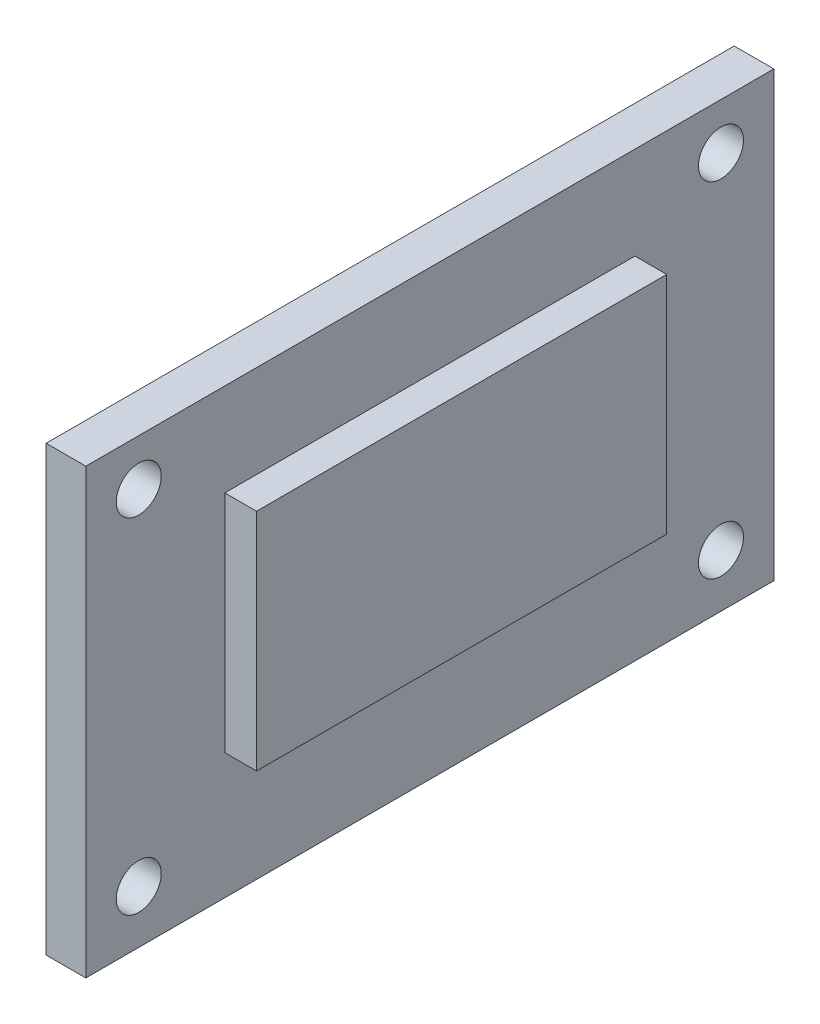
ISO-10303-21;
HEADER;
FILE_DESCRIPTION(('STEP AP214'),'2;1');
FILE_NAME('part.step','',(''),(''),'','','');
FILE_SCHEMA(('AUTOMOTIVE_DESIGN { 1 0 10303 214 1 1 1 1 }'));
ENDSEC;
DATA;
#1=APPLICATION_CONTEXT('core data for automotive mechanical design processes');
#2=APPLICATION_PROTOCOL_DEFINITION('international standard','automotive_design',2000,#1);
#3=PRODUCT_CONTEXT('',#1,'mechanical');
#4=PRODUCT('Part','Part','',(#3));
#5=PRODUCT_RELATED_PRODUCT_CATEGORY('part','',(#4));
#6=PRODUCT_DEFINITION_FORMATION('','',#4);
#7=PRODUCT_DEFINITION_CONTEXT('part definition',#1,'design');
#8=PRODUCT_DEFINITION('design','',#6,#7);
#9=PRODUCT_DEFINITION_SHAPE('','',#8);
#10=(LENGTH_UNIT() NAMED_UNIT(*) SI_UNIT(.MILLI.,.METRE.));
#11=(NAMED_UNIT(*) PLANE_ANGLE_UNIT() SI_UNIT($,.RADIAN.));
#12=(NAMED_UNIT(*) SI_UNIT($,.STERADIAN.) SOLID_ANGLE_UNIT());
#13=UNCERTAINTY_MEASURE_WITH_UNIT(LENGTH_MEASURE(1.E-05),#10,'distance_accuracy_value','');
#14=(GEOMETRIC_REPRESENTATION_CONTEXT(3) GLOBAL_UNCERTAINTY_ASSIGNED_CONTEXT((#13)) GLOBAL_UNIT_ASSIGNED_CONTEXT((#10,
#11,#12)) REPRESENTATION_CONTEXT('',''));
#15=CARTESIAN_POINT('',(0.,0.,0.));
#16=DIRECTION('',(0.,0.,1.));
#17=DIRECTION('',(1.,0.,0.));
#18=AXIS2_PLACEMENT_3D('',#15,#16,#17);
#19=CARTESIAN_POINT('',(-72.4,0.,0.));
#20=DIRECTION('',(1.,0.,0.));
#21=DIRECTION('',(0.,0.,-1.));
#22=AXIS2_PLACEMENT_3D('',#19,#20,#21);
#23=PLANE('',#22);
#24=CARTESIAN_POINT('',(-72.4,3.,86.));
#25=DIRECTION('',(1.,0.,0.));
#26=DIRECTION('',(0.,0.,-1.));
#27=AXIS2_PLACEMENT_3D('',#24,#25,#26);
#28=CIRCLE('',#27,1.69999999999999);
#29=CARTESIAN_POINT('',(-72.4,3.,84.3));
#30=VERTEX_POINT('',#29);
#31=EDGE_CURVE('E136',#30,#30,#28,.F.);
#32=ORIENTED_EDGE('',*,*,#31,.T.);
#33=EDGE_LOOP('',(#32));
#34=FACE_BOUND('',#33,.T.);
#35=CARTESIAN_POINT('',(-72.4,-23.,42.));
#36=DIRECTION('',(1.,0.,0.));
#37=DIRECTION('',(0.,0.,-1.));
#38=AXIS2_PLACEMENT_3D('',#35,#36,#37);
#39=CIRCLE('',#38,1.7);
#40=CARTESIAN_POINT('',(-72.4,-23.,40.3));
#41=VERTEX_POINT('',#40);
#42=EDGE_CURVE('E182',#41,#41,#39,.F.);
#43=ORIENTED_EDGE('',*,*,#42,.T.);
#44=EDGE_LOOP('',(#43));
#45=FACE_BOUND('',#44,.T.);
#46=CARTESIAN_POINT('',(-72.4,3.,42.));
#47=DIRECTION('',(1.,0.,0.));
#48=DIRECTION('',(0.,0.,-1.));
#49=AXIS2_PLACEMENT_3D('',#46,#47,#48);
#50=CIRCLE('',#49,1.7);
#51=CARTESIAN_POINT('',(-72.4,3.,40.3));
#52=VERTEX_POINT('',#51);
#53=EDGE_CURVE('E179',#52,#52,#50,.F.);
#54=ORIENTED_EDGE('',*,*,#53,.T.);
#55=EDGE_LOOP('',(#54));
#56=FACE_BOUND('',#55,.T.);
#57=CARTESIAN_POINT('',(-72.4,-23.,86.));
#58=DIRECTION('',(1.,0.,0.));
#59=DIRECTION('',(0.,0.,-1.));
#60=AXIS2_PLACEMENT_3D('',#57,#58,#59);
#61=CIRCLE('',#60,1.69999999999999);
#62=CARTESIAN_POINT('',(-72.4,-23.,84.3));
#63=VERTEX_POINT('',#62);
#64=EDGE_CURVE('E176',#63,#63,#61,.F.);
#65=ORIENTED_EDGE('',*,*,#64,.T.);
#66=EDGE_LOOP('',(#65));
#67=FACE_BOUND('',#66,.T.);
#68=DIRECTION('',(0.,-1.,0.));
#69=VECTOR('',#68,1.);
#70=CARTESIAN_POINT('',(-72.4,6.5,90.));
#71=LINE('',#70,#69);
#72=CARTESIAN_POINT('',(-72.4,6.5,90.));
#73=VERTEX_POINT('',#72);
#74=CARTESIAN_POINT('',(-72.4,-27.,90.));
#75=VERTEX_POINT('',#74);
#76=EDGE_CURVE('E147',#73,#75,#71,.T.);
#77=ORIENTED_EDGE('',*,*,#76,.T.);
#78=DIRECTION('',(0.,0.,-1.));
#79=VECTOR('',#78,1.);
#80=CARTESIAN_POINT('',(-72.4,-27.,90.));
#81=LINE('',#80,#79);
#82=CARTESIAN_POINT('',(-72.4,-27.,38.));
#83=VERTEX_POINT('',#82);
#84=EDGE_CURVE('E94',#75,#83,#81,.T.);
#85=ORIENTED_EDGE('',*,*,#84,.T.);
#86=DIRECTION('',(0.,1.,0.));
#87=VECTOR('',#86,1.);
#88=CARTESIAN_POINT('',(-72.4,-27.,38.));
#89=LINE('',#88,#87);
#90=CARTESIAN_POINT('',(-72.4,6.5,38.));
#91=VERTEX_POINT('',#90);
#92=EDGE_CURVE('E150',#83,#91,#89,.T.);
#93=ORIENTED_EDGE('',*,*,#92,.T.);
#94=DIRECTION('',(0.,0.,1.));
#95=VECTOR('',#94,1.);
#96=CARTESIAN_POINT('',(-72.4,6.5,38.));
#97=LINE('',#96,#95);
#98=EDGE_CURVE('E65',#91,#73,#97,.T.);
#99=ORIENTED_EDGE('',*,*,#98,.T.);
#100=EDGE_LOOP('',(#77,#85,#93,#99));
#101=FACE_BOUND('',#100,.T.);
#102=DIRECTION('',(0.,0.,1.));
#103=VECTOR('',#102,1.);
#104=CARTESIAN_POINT('',(-72.4,-17.5,0.));
#105=LINE('',#104,#103);
#106=CARTESIAN_POINT('',(-72.4,-17.5,48.5));
#107=VERTEX_POINT('',#106);
#108=CARTESIAN_POINT('',(-72.4,-17.5,79.5));
#109=VERTEX_POINT('',#108);
#110=EDGE_CURVE('E48',#107,#109,#105,.T.);
#111=ORIENTED_EDGE('',*,*,#110,.T.);
#112=DIRECTION('',(0.,1.,0.));
#113=VECTOR('',#112,1.);
#114=CARTESIAN_POINT('',(-72.4,0.,79.5));
#115=LINE('',#114,#113);
#116=CARTESIAN_POINT('',(-72.4,-0.5,79.5));
#117=VERTEX_POINT('',#116);
#118=EDGE_CURVE('E11',#109,#117,#115,.T.);
#119=ORIENTED_EDGE('',*,*,#118,.T.);
#120=DIRECTION('',(0.,0.,-1.));
#121=VECTOR('',#120,1.);
#122=CARTESIAN_POINT('',(-72.4,-0.5,0.));
#123=LINE('',#122,#121);
#124=CARTESIAN_POINT('',(-72.4,-0.5,48.5));
#125=VERTEX_POINT('',#124);
#126=EDGE_CURVE('E166',#117,#125,#123,.T.);
#127=ORIENTED_EDGE('',*,*,#126,.T.);
#128=DIRECTION('',(0.,-1.,0.));
#129=VECTOR('',#128,1.);
#130=CARTESIAN_POINT('',(-72.4,0.,48.5));
#131=LINE('',#130,#129);
#132=EDGE_CURVE('E169',#125,#107,#131,.T.);
#133=ORIENTED_EDGE('',*,*,#132,.T.);
#134=EDGE_LOOP('',(#111,#119,#127,#133));
#135=FACE_BOUND('',#134,.T.);
#136=ADVANCED_FACE('F39',(#34,#45,#56,#67,#101,#135),#23,.T.);
#137=CARTESIAN_POINT('',(-72.4,6.5,90.));
#138=DIRECTION('',(0.,0.,-1.));
#139=DIRECTION('',(-1.,0.,0.));
#140=AXIS2_PLACEMENT_3D('',#137,#138,#139);
#141=PLANE('',#140);
#142=DIRECTION('',(0.,-1.,0.));
#143=VECTOR('',#142,1.);
#144=CARTESIAN_POINT('',(-75.4,6.5,90.));
#145=LINE('',#144,#143);
#146=CARTESIAN_POINT('',(-75.4,6.5,90.));
#147=VERTEX_POINT('',#146);
#148=CARTESIAN_POINT('',(-75.4,-27.,90.));
#149=VERTEX_POINT('',#148);
#150=EDGE_CURVE('E139',#147,#149,#145,.T.);
#151=ORIENTED_EDGE('',*,*,#150,.T.);
#152=DIRECTION('',(-1.,0.,0.));
#153=VECTOR('',#152,1.);
#154=CARTESIAN_POINT('',(-72.4,-27.,90.));
#155=LINE('',#154,#153);
#156=EDGE_CURVE('E164',#75,#149,#155,.T.);
#157=ORIENTED_EDGE('',*,*,#156,.F.);
#158=ORIENTED_EDGE('',*,*,#76,.F.);
#159=DIRECTION('',(-1.,0.,0.));
#160=VECTOR('',#159,1.);
#161=CARTESIAN_POINT('',(-72.4,6.5,90.));
#162=LINE('',#161,#160);
#163=EDGE_CURVE('E152',#73,#147,#162,.T.);
#164=ORIENTED_EDGE('',*,*,#163,.T.);
#165=EDGE_LOOP('',(#151,#157,#158,#164));
#166=FACE_BOUND('',#165,.T.);
#167=ADVANCED_FACE('F41',(#166),#141,.F.);
#168=CARTESIAN_POINT('',(-72.4,-27.,90.));
#169=DIRECTION('',(0.,1.,0.));
#170=DIRECTION('',(0.,0.,1.));
#171=AXIS2_PLACEMENT_3D('',#168,#169,#170);
#172=PLANE('',#171);
#173=DIRECTION('',(0.,0.,-1.));
#174=VECTOR('',#173,1.);
#175=CARTESIAN_POINT('',(-75.4,-27.,90.));
#176=LINE('',#175,#174);
#177=CARTESIAN_POINT('',(-75.4,-27.,38.));
#178=VERTEX_POINT('',#177);
#179=EDGE_CURVE('E142',#149,#178,#176,.T.);
#180=ORIENTED_EDGE('',*,*,#179,.T.);
#181=DIRECTION('',(-1.,0.,0.));
#182=VECTOR('',#181,1.);
#183=CARTESIAN_POINT('',(-72.4,-27.,38.));
#184=LINE('',#183,#182);
#185=EDGE_CURVE('E161',#83,#178,#184,.T.);
#186=ORIENTED_EDGE('',*,*,#185,.F.);
#187=ORIENTED_EDGE('',*,*,#84,.F.);
#188=ORIENTED_EDGE('',*,*,#156,.T.);
#189=EDGE_LOOP('',(#180,#186,#187,#188));
#190=FACE_BOUND('',#189,.T.);
#191=ADVANCED_FACE('F218',(#190),#172,.F.);
#192=CARTESIAN_POINT('',(-72.4,-27.,38.));
#193=DIRECTION('',(0.,0.,1.));
#194=DIRECTION('',(1.,0.,0.));
#195=AXIS2_PLACEMENT_3D('',#192,#193,#194);
#196=PLANE('',#195);
#197=DIRECTION('',(0.,1.,0.));
#198=VECTOR('',#197,1.);
#199=CARTESIAN_POINT('',(-75.4,-27.,38.));
#200=LINE('',#199,#198);
#201=CARTESIAN_POINT('',(-75.4,6.5,38.));
#202=VERTEX_POINT('',#201);
#203=EDGE_CURVE('E155',#178,#202,#200,.T.);
#204=ORIENTED_EDGE('',*,*,#203,.T.);
#205=DIRECTION('',(-1.,0.,0.));
#206=VECTOR('',#205,1.);
#207=CARTESIAN_POINT('',(-72.4,6.5,38.));
#208=LINE('',#207,#206);
#209=EDGE_CURVE('E159',#91,#202,#208,.T.);
#210=ORIENTED_EDGE('',*,*,#209,.F.);
#211=ORIENTED_EDGE('',*,*,#92,.F.);
#212=ORIENTED_EDGE('',*,*,#185,.T.);
#213=EDGE_LOOP('',(#204,#210,#211,#212));
#214=FACE_BOUND('',#213,.T.);
#215=ADVANCED_FACE('F230',(#214),#196,.F.);
#216=CARTESIAN_POINT('',(-72.4,6.5,38.));
#217=DIRECTION('',(0.,-1.,0.));
#218=DIRECTION('',(0.,0.,-1.));
#219=AXIS2_PLACEMENT_3D('',#216,#217,#218);
#220=PLANE('',#219);
#221=DIRECTION('',(0.,0.,1.));
#222=VECTOR('',#221,1.);
#223=CARTESIAN_POINT('',(-75.4,6.5,38.));
#224=LINE('',#223,#222);
#225=EDGE_CURVE('E86',#202,#147,#224,.T.);
#226=ORIENTED_EDGE('',*,*,#225,.T.);
#227=ORIENTED_EDGE('',*,*,#163,.F.);
#228=ORIENTED_EDGE('',*,*,#98,.F.);
#229=ORIENTED_EDGE('',*,*,#209,.T.);
#230=EDGE_LOOP('',(#226,#227,#228,#229));
#231=FACE_BOUND('',#230,.T.);
#232=ADVANCED_FACE('F226',(#231),#220,.F.);
#233=CARTESIAN_POINT('',(-75.4,0.,0.));
#234=DIRECTION('',(1.,0.,0.));
#235=DIRECTION('',(0.,0.,-1.));
#236=AXIS2_PLACEMENT_3D('',#233,#234,#235);
#237=PLANE('',#236);
#238=CARTESIAN_POINT('',(-75.4,3.,86.));
#239=DIRECTION('',(1.,0.,0.));
#240=DIRECTION('',(0.,0.,-1.));
#241=AXIS2_PLACEMENT_3D('',#238,#239,#240);
#242=CIRCLE('',#241,1.69999999999999);
#243=CARTESIAN_POINT('',(-75.4,3.,84.3));
#244=VERTEX_POINT('',#243);
#245=EDGE_CURVE('E43',#244,#244,#242,.F.);
#246=ORIENTED_EDGE('',*,*,#245,.F.);
#247=EDGE_LOOP('',(#246));
#248=FACE_BOUND('',#247,.T.);
#249=CARTESIAN_POINT('',(-75.4,-23.,42.));
#250=DIRECTION('',(1.,0.,0.));
#251=DIRECTION('',(0.,0.,-1.));
#252=AXIS2_PLACEMENT_3D('',#249,#250,#251);
#253=CIRCLE('',#252,1.7);
#254=CARTESIAN_POINT('',(-75.4,-23.,40.3));
#255=VERTEX_POINT('',#254);
#256=EDGE_CURVE('E180',#255,#255,#253,.F.);
#257=ORIENTED_EDGE('',*,*,#256,.F.);
#258=EDGE_LOOP('',(#257));
#259=FACE_BOUND('',#258,.T.);
#260=CARTESIAN_POINT('',(-75.4,3.,42.));
#261=DIRECTION('',(1.,0.,0.));
#262=DIRECTION('',(0.,0.,-1.));
#263=AXIS2_PLACEMENT_3D('',#260,#261,#262);
#264=CIRCLE('',#263,1.7);
#265=CARTESIAN_POINT('',(-75.4,3.,40.3));
#266=VERTEX_POINT('',#265);
#267=EDGE_CURVE('E177',#266,#266,#264,.F.);
#268=ORIENTED_EDGE('',*,*,#267,.F.);
#269=EDGE_LOOP('',(#268));
#270=FACE_BOUND('',#269,.T.);
#271=CARTESIAN_POINT('',(-75.4,-23.,86.));
#272=DIRECTION('',(1.,0.,0.));
#273=DIRECTION('',(0.,0.,-1.));
#274=AXIS2_PLACEMENT_3D('',#271,#272,#273);
#275=CIRCLE('',#274,1.69999999999999);
#276=CARTESIAN_POINT('',(-75.4,-23.,84.3));
#277=VERTEX_POINT('',#276);
#278=EDGE_CURVE('E173',#277,#277,#275,.F.);
#279=ORIENTED_EDGE('',*,*,#278,.F.);
#280=EDGE_LOOP('',(#279));
#281=FACE_BOUND('',#280,.T.);
#282=ORIENTED_EDGE('',*,*,#150,.F.);
#283=ORIENTED_EDGE('',*,*,#225,.F.);
#284=ORIENTED_EDGE('',*,*,#203,.F.);
#285=ORIENTED_EDGE('',*,*,#179,.F.);
#286=EDGE_LOOP('',(#282,#283,#284,#285));
#287=FACE_BOUND('',#286,.T.);
#288=ADVANCED_FACE('F224',(#248,#259,#270,#281,#287),#237,.F.);
#289=CARTESIAN_POINT('',(-70.,-0.5,79.5));
#290=DIRECTION('',(0.,0.,-1.));
#291=DIRECTION('',(-1.,0.,0.));
#292=AXIS2_PLACEMENT_3D('',#289,#290,#291);
#293=PLANE('',#292);
#294=ORIENTED_EDGE('',*,*,#118,.F.);
#295=DIRECTION('',(-1.,0.,0.));
#296=VECTOR('',#295,1.);
#297=CARTESIAN_POINT('',(-70.,-17.5,79.5));
#298=LINE('',#297,#296);
#299=CARTESIAN_POINT('',(-70.,-17.5,79.5));
#300=VERTEX_POINT('',#299);
#301=EDGE_CURVE('E121',#300,#109,#298,.T.);
#302=ORIENTED_EDGE('',*,*,#301,.F.);
#303=DIRECTION('',(0.,-1.,0.));
#304=VECTOR('',#303,1.);
#305=CARTESIAN_POINT('',(-70.,-0.5,79.5));
#306=LINE('',#305,#304);
#307=CARTESIAN_POINT('',(-70.,-0.5,79.5));
#308=VERTEX_POINT('',#307);
#309=EDGE_CURVE('E128',#308,#300,#306,.T.);
#310=ORIENTED_EDGE('',*,*,#309,.F.);
#311=DIRECTION('',(-1.,0.,0.));
#312=VECTOR('',#311,1.);
#313=CARTESIAN_POINT('',(-70.,-0.5,79.5));
#314=LINE('',#313,#312);
#315=EDGE_CURVE('E197',#308,#117,#314,.T.);
#316=ORIENTED_EDGE('',*,*,#315,.T.);
#317=EDGE_LOOP('',(#294,#302,#310,#316));
#318=FACE_BOUND('',#317,.T.);
#319=ADVANCED_FACE('F138',(#318),#293,.F.);
#320=CARTESIAN_POINT('',(-70.,-17.5,79.5));
#321=DIRECTION('',(0.,1.,0.));
#322=DIRECTION('',(0.,0.,1.));
#323=AXIS2_PLACEMENT_3D('',#320,#321,#322);
#324=PLANE('',#323);
#325=ORIENTED_EDGE('',*,*,#110,.F.);
#326=DIRECTION('',(-1.,0.,0.));
#327=VECTOR('',#326,1.);
#328=CARTESIAN_POINT('',(-70.,-17.5,48.5));
#329=LINE('',#328,#327);
#330=CARTESIAN_POINT('',(-70.,-17.5,48.5));
#331=VERTEX_POINT('',#330);
#332=EDGE_CURVE('E124',#331,#107,#329,.T.);
#333=ORIENTED_EDGE('',*,*,#332,.F.);
#334=DIRECTION('',(0.,0.,-1.));
#335=VECTOR('',#334,1.);
#336=CARTESIAN_POINT('',(-70.,-17.5,79.5));
#337=LINE('',#336,#335);
#338=EDGE_CURVE('E117',#300,#331,#337,.T.);
#339=ORIENTED_EDGE('',*,*,#338,.F.);
#340=ORIENTED_EDGE('',*,*,#301,.T.);
#341=EDGE_LOOP('',(#325,#333,#339,#340));
#342=FACE_BOUND('',#341,.T.);
#343=ADVANCED_FACE('F119',(#342),#324,.F.);
#344=CARTESIAN_POINT('',(-70.,-17.5,48.5));
#345=DIRECTION('',(0.,0.,1.));
#346=DIRECTION('',(1.,0.,0.));
#347=AXIS2_PLACEMENT_3D('',#344,#345,#346);
#348=PLANE('',#347);
#349=ORIENTED_EDGE('',*,*,#132,.F.);
#350=DIRECTION('',(-1.,0.,0.));
#351=VECTOR('',#350,1.);
#352=CARTESIAN_POINT('',(-70.,-0.5,48.5));
#353=LINE('',#352,#351);
#354=CARTESIAN_POINT('',(-70.,-0.5,48.5));
#355=VERTEX_POINT('',#354);
#356=EDGE_CURVE('E56',#355,#125,#353,.T.);
#357=ORIENTED_EDGE('',*,*,#356,.F.);
#358=DIRECTION('',(0.,1.,0.));
#359=VECTOR('',#358,1.);
#360=CARTESIAN_POINT('',(-70.,-17.5,48.5));
#361=LINE('',#360,#359);
#362=EDGE_CURVE('E127',#331,#355,#361,.T.);
#363=ORIENTED_EDGE('',*,*,#362,.F.);
#364=ORIENTED_EDGE('',*,*,#332,.T.);
#365=EDGE_LOOP('',(#349,#357,#363,#364));
#366=FACE_BOUND('',#365,.T.);
#367=ADVANCED_FACE('F200',(#366),#348,.F.);
#368=CARTESIAN_POINT('',(-70.,-0.5,48.5));
#369=DIRECTION('',(0.,-1.,0.));
#370=DIRECTION('',(0.,0.,-1.));
#371=AXIS2_PLACEMENT_3D('',#368,#369,#370);
#372=PLANE('',#371);
#373=ORIENTED_EDGE('',*,*,#126,.F.);
#374=ORIENTED_EDGE('',*,*,#315,.F.);
#375=DIRECTION('',(0.,0.,1.));
#376=VECTOR('',#375,1.);
#377=CARTESIAN_POINT('',(-70.,-0.5,48.5));
#378=LINE('',#377,#376);
#379=EDGE_CURVE('E132',#355,#308,#378,.T.);
#380=ORIENTED_EDGE('',*,*,#379,.F.);
#381=ORIENTED_EDGE('',*,*,#356,.T.);
#382=EDGE_LOOP('',(#373,#374,#380,#381));
#383=FACE_BOUND('',#382,.T.);
#384=ADVANCED_FACE('F201',(#383),#372,.F.);
#385=CARTESIAN_POINT('',(-70.,0.,0.));
#386=DIRECTION('',(1.,0.,0.));
#387=DIRECTION('',(0.,0.,-1.));
#388=AXIS2_PLACEMENT_3D('',#385,#386,#387);
#389=PLANE('',#388);
#390=ORIENTED_EDGE('',*,*,#309,.T.);
#391=ORIENTED_EDGE('',*,*,#338,.T.);
#392=ORIENTED_EDGE('',*,*,#362,.T.);
#393=ORIENTED_EDGE('',*,*,#379,.T.);
#394=EDGE_LOOP('',(#390,#391,#392,#393));
#395=FACE_BOUND('',#394,.T.);
#396=ADVANCED_FACE('F131',(#395),#389,.T.);
#397=CARTESIAN_POINT('',(-71.4,-23.,86.));
#398=DIRECTION('',(-1.,0.,0.));
#399=DIRECTION('',(0.,0.,1.));
#400=AXIS2_PLACEMENT_3D('',#397,#398,#399);
#401=CYLINDRICAL_SURFACE('',#400,1.69999999999999);
#402=ORIENTED_EDGE('',*,*,#64,.F.);
#403=EDGE_LOOP('',(#402));
#404=FACE_BOUND('',#403,.T.);
#405=ORIENTED_EDGE('',*,*,#278,.T.);
#406=EDGE_LOOP('',(#405));
#407=FACE_BOUND('',#406,.T.);
#408=ADVANCED_FACE('F208',(#404,#407),#401,.F.);
#409=CARTESIAN_POINT('',(-71.4,3.,42.));
#410=DIRECTION('',(-1.,0.,0.));
#411=DIRECTION('',(0.,0.,1.));
#412=AXIS2_PLACEMENT_3D('',#409,#410,#411);
#413=CYLINDRICAL_SURFACE('',#412,1.7);
#414=ORIENTED_EDGE('',*,*,#53,.F.);
#415=EDGE_LOOP('',(#414));
#416=FACE_BOUND('',#415,.T.);
#417=ORIENTED_EDGE('',*,*,#267,.T.);
#418=EDGE_LOOP('',(#417));
#419=FACE_BOUND('',#418,.T.);
#420=ADVANCED_FACE('F294',(#416,#419),#413,.F.);
#421=CARTESIAN_POINT('',(-71.4,-23.,42.));
#422=DIRECTION('',(-1.,0.,0.));
#423=DIRECTION('',(0.,0.,1.));
#424=AXIS2_PLACEMENT_3D('',#421,#422,#423);
#425=CYLINDRICAL_SURFACE('',#424,1.7);
#426=ORIENTED_EDGE('',*,*,#42,.F.);
#427=EDGE_LOOP('',(#426));
#428=FACE_BOUND('',#427,.T.);
#429=ORIENTED_EDGE('',*,*,#256,.T.);
#430=EDGE_LOOP('',(#429));
#431=FACE_BOUND('',#430,.T.);
#432=ADVANCED_FACE('F304',(#428,#431),#425,.F.);
#433=CARTESIAN_POINT('',(-71.4,3.,86.));
#434=DIRECTION('',(-1.,0.,0.));
#435=DIRECTION('',(0.,0.,1.));
#436=AXIS2_PLACEMENT_3D('',#433,#434,#435);
#437=CYLINDRICAL_SURFACE('',#436,1.69999999999999);
#438=ORIENTED_EDGE('',*,*,#31,.F.);
#439=EDGE_LOOP('',(#438));
#440=FACE_BOUND('',#439,.T.);
#441=ORIENTED_EDGE('',*,*,#245,.T.);
#442=EDGE_LOOP('',(#441));
#443=FACE_BOUND('',#442,.T.);
#444=ADVANCED_FACE('F314',(#440,#443),#437,.F.);
#445=CLOSED_SHELL('',(#136,#167,#191,#215,#232,#288,#319,#343,#367,#384,#396,#408,#420,#432,#444));
#446=MANIFOLD_SOLID_BREP('B2',#445);
#447=ADVANCED_BREP_SHAPE_REPRESENTATION('',(#18,#446),#14);
#448=SHAPE_DEFINITION_REPRESENTATION(#9,#447);
ENDSEC;
END-ISO-10303-21;
